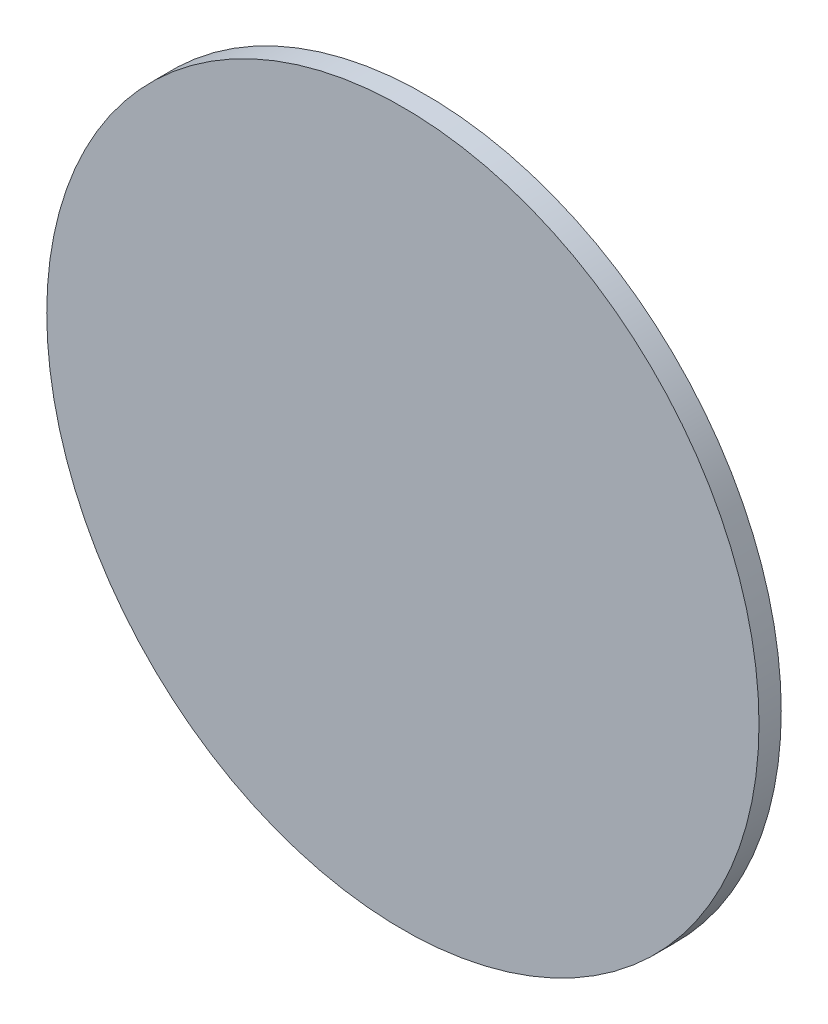
ISO-10303-21;
HEADER;
FILE_DESCRIPTION(('STEP AP214'),'2;1');
FILE_NAME('part.step','',(''),(''),'','','');
FILE_SCHEMA(('AUTOMOTIVE_DESIGN { 1 0 10303 214 1 1 1 1 }'));
ENDSEC;
DATA;
#1=APPLICATION_CONTEXT('core data for automotive mechanical design processes');
#2=APPLICATION_PROTOCOL_DEFINITION('international standard','automotive_design',2000,#1);
#3=PRODUCT_CONTEXT('',#1,'mechanical');
#4=PRODUCT('Part','Part','',(#3));
#5=PRODUCT_RELATED_PRODUCT_CATEGORY('part','',(#4));
#6=PRODUCT_DEFINITION_FORMATION('','',#4);
#7=PRODUCT_DEFINITION_CONTEXT('part definition',#1,'design');
#8=PRODUCT_DEFINITION('design','',#6,#7);
#9=PRODUCT_DEFINITION_SHAPE('','',#8);
#10=(LENGTH_UNIT() NAMED_UNIT(*) SI_UNIT(.MILLI.,.METRE.));
#11=(NAMED_UNIT(*) PLANE_ANGLE_UNIT() SI_UNIT($,.RADIAN.));
#12=(NAMED_UNIT(*) SI_UNIT($,.STERADIAN.) SOLID_ANGLE_UNIT());
#13=UNCERTAINTY_MEASURE_WITH_UNIT(LENGTH_MEASURE(1.E-05),#10,'distance_accuracy_value','');
#14=(GEOMETRIC_REPRESENTATION_CONTEXT(3) GLOBAL_UNCERTAINTY_ASSIGNED_CONTEXT((#13)) GLOBAL_UNIT_ASSIGNED_CONTEXT((#10,
#11,#12)) REPRESENTATION_CONTEXT('',''));
#15=CARTESIAN_POINT('',(0.,0.,0.));
#16=DIRECTION('',(0.,0.,1.));
#17=DIRECTION('',(1.,0.,0.));
#18=AXIS2_PLACEMENT_3D('',#15,#16,#17);
#19=CARTESIAN_POINT('',(0.,0.,10.));
#20=DIRECTION('',(0.,0.,-1.));
#21=DIRECTION('',(-1.,0.,0.));
#22=AXIS2_PLACEMENT_3D('',#19,#20,#21);
#23=CYLINDRICAL_SURFACE('',#22,160.);
#24=CARTESIAN_POINT('',(0.,0.,10.));
#25=DIRECTION('',(0.,0.,1.));
#26=DIRECTION('',(1.,0.,0.));
#27=AXIS2_PLACEMENT_3D('',#24,#25,#26);
#28=CIRCLE('',#27,160.);
#29=CARTESIAN_POINT('',(160.,0.,10.));
#30=VERTEX_POINT('',#29);
#31=EDGE_CURVE('E10',#30,#30,#28,.T.);
#32=ORIENTED_EDGE('',*,*,#31,.F.);
#33=EDGE_LOOP('',(#32));
#34=FACE_BOUND('',#33,.T.);
#35=CARTESIAN_POINT('',(0.,0.,0.));
#36=DIRECTION('',(0.,0.,1.));
#37=DIRECTION('',(1.,0.,0.));
#38=AXIS2_PLACEMENT_3D('',#35,#36,#37);
#39=CIRCLE('',#38,160.);
#40=CARTESIAN_POINT('',(160.,0.,0.));
#41=VERTEX_POINT('',#40);
#42=EDGE_CURVE('E40',#41,#41,#39,.T.);
#43=ORIENTED_EDGE('',*,*,#42,.T.);
#44=EDGE_LOOP('',(#43));
#45=FACE_BOUND('',#44,.T.);
#46=ADVANCED_FACE('F37',(#34,#45),#23,.T.);
#47=CARTESIAN_POINT('',(0.,0.,10.));
#48=DIRECTION('',(0.,0.,1.));
#49=DIRECTION('',(1.,0.,0.));
#50=AXIS2_PLACEMENT_3D('',#47,#48,#49);
#51=PLANE('',#50);
#52=ORIENTED_EDGE('',*,*,#31,.T.);
#53=EDGE_LOOP('',(#52));
#54=FACE_BOUND('',#53,.T.);
#55=ADVANCED_FACE('F54',(#54),#51,.T.);
#56=CARTESIAN_POINT('',(0.,0.,0.));
#57=DIRECTION('',(0.,0.,1.));
#58=DIRECTION('',(1.,0.,0.));
#59=AXIS2_PLACEMENT_3D('',#56,#57,#58);
#60=PLANE('',#59);
#61=ORIENTED_EDGE('',*,*,#42,.F.);
#62=EDGE_LOOP('',(#61));
#63=FACE_BOUND('',#62,.T.);
#64=ADVANCED_FACE('F52',(#63),#60,.F.);
#65=CLOSED_SHELL('',(#46,#55,#64));
#66=MANIFOLD_SOLID_BREP('B2',#65);
#67=ADVANCED_BREP_SHAPE_REPRESENTATION('',(#18,#66),#14);
#68=SHAPE_DEFINITION_REPRESENTATION(#9,#67);
ENDSEC;
END-ISO-10303-21;
